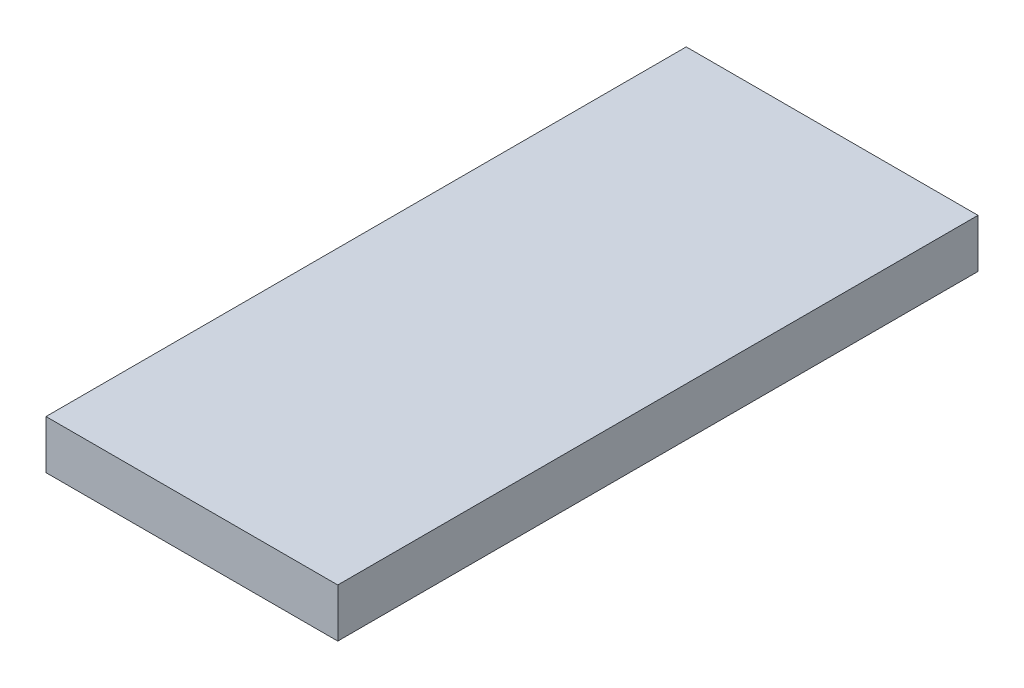
ISO-10303-21;
HEADER;
FILE_DESCRIPTION(('STEP AP214'),'2;1');
FILE_NAME('part.step','',(''),(''),'','','');
FILE_SCHEMA(('AUTOMOTIVE_DESIGN { 1 0 10303 214 1 1 1 1 }'));
ENDSEC;
DATA;
#1=APPLICATION_CONTEXT('core data for automotive mechanical design processes');
#2=APPLICATION_PROTOCOL_DEFINITION('international standard','automotive_design',2000,#1);
#3=PRODUCT_CONTEXT('',#1,'mechanical');
#4=PRODUCT('Part','Part','',(#3));
#5=PRODUCT_RELATED_PRODUCT_CATEGORY('part','',(#4));
#6=PRODUCT_DEFINITION_FORMATION('','',#4);
#7=PRODUCT_DEFINITION_CONTEXT('part definition',#1,'design');
#8=PRODUCT_DEFINITION('design','',#6,#7);
#9=PRODUCT_DEFINITION_SHAPE('','',#8);
#10=(LENGTH_UNIT() NAMED_UNIT(*) SI_UNIT(.MILLI.,.METRE.));
#11=(NAMED_UNIT(*) PLANE_ANGLE_UNIT() SI_UNIT($,.RADIAN.));
#12=(NAMED_UNIT(*) SI_UNIT($,.STERADIAN.) SOLID_ANGLE_UNIT());
#13=UNCERTAINTY_MEASURE_WITH_UNIT(LENGTH_MEASURE(1.E-05),#10,'distance_accuracy_value','');
#14=(GEOMETRIC_REPRESENTATION_CONTEXT(3) GLOBAL_UNCERTAINTY_ASSIGNED_CONTEXT((#13)) GLOBAL_UNIT_ASSIGNED_CONTEXT((#10,
#11,#12)) REPRESENTATION_CONTEXT('',''));
#15=CARTESIAN_POINT('',(0.,0.,0.));
#16=DIRECTION('',(0.,0.,1.));
#17=DIRECTION('',(1.,0.,0.));
#18=AXIS2_PLACEMENT_3D('',#15,#16,#17);
#19=CARTESIAN_POINT('',(18.,3.,0.));
#20=DIRECTION('',(0.,0.,-1.));
#21=DIRECTION('',(-1.,0.,0.));
#22=AXIS2_PLACEMENT_3D('',#19,#20,#21);
#23=PLANE('',#22);
#24=DIRECTION('',(1.,0.,0.));
#25=VECTOR('',#24,1.);
#26=CARTESIAN_POINT('',(18.,0.,0.));
#27=LINE('',#26,#25);
#28=CARTESIAN_POINT('',(0.,0.,0.));
#29=VERTEX_POINT('',#28);
#30=CARTESIAN_POINT('',(18.,0.,0.));
#31=VERTEX_POINT('',#30);
#32=EDGE_CURVE('E95',#29,#31,#27,.T.);
#33=ORIENTED_EDGE('',*,*,#32,.T.);
#34=DIRECTION('',(0.,-1.,0.));
#35=VECTOR('',#34,1.);
#36=CARTESIAN_POINT('',(18.,3.,0.));
#37=LINE('',#36,#35);
#38=CARTESIAN_POINT('',(18.,3.,0.));
#39=VERTEX_POINT('',#38);
#40=EDGE_CURVE('E11',#39,#31,#37,.T.);
#41=ORIENTED_EDGE('',*,*,#40,.F.);
#42=DIRECTION('',(1.,0.,0.));
#43=VECTOR('',#42,1.);
#44=CARTESIAN_POINT('',(18.,3.,0.));
#45=LINE('',#44,#43);
#46=CARTESIAN_POINT('',(0.,3.,0.));
#47=VERTEX_POINT('',#46);
#48=EDGE_CURVE('E83',#47,#39,#45,.T.);
#49=ORIENTED_EDGE('',*,*,#48,.F.);
#50=DIRECTION('',(0.,-1.,0.));
#51=VECTOR('',#50,1.);
#52=CARTESIAN_POINT('',(0.,3.,0.));
#53=LINE('',#52,#51);
#54=EDGE_CURVE('E91',#47,#29,#53,.T.);
#55=ORIENTED_EDGE('',*,*,#54,.T.);
#56=EDGE_LOOP('',(#33,#41,#49,#55));
#57=FACE_BOUND('',#56,.T.);
#58=ADVANCED_FACE('F32',(#57),#23,.F.);
#59=CARTESIAN_POINT('',(18.,3.,-39.5));
#60=DIRECTION('',(-1.,0.,0.));
#61=DIRECTION('',(0.,0.,1.));
#62=AXIS2_PLACEMENT_3D('',#59,#60,#61);
#63=PLANE('',#62);
#64=DIRECTION('',(0.,0.,-1.));
#65=VECTOR('',#64,1.);
#66=CARTESIAN_POINT('',(18.,0.,-39.5));
#67=LINE('',#66,#65);
#68=CARTESIAN_POINT('',(18.,0.,-39.5));
#69=VERTEX_POINT('',#68);
#70=EDGE_CURVE('E87',#31,#69,#67,.T.);
#71=ORIENTED_EDGE('',*,*,#70,.T.);
#72=DIRECTION('',(0.,-1.,0.));
#73=VECTOR('',#72,1.);
#74=CARTESIAN_POINT('',(18.,3.,-39.5));
#75=LINE('',#74,#73);
#76=CARTESIAN_POINT('',(18.,3.,-39.5));
#77=VERTEX_POINT('',#76);
#78=EDGE_CURVE('E40',#77,#69,#75,.T.);
#79=ORIENTED_EDGE('',*,*,#78,.F.);
#80=DIRECTION('',(0.,0.,-1.));
#81=VECTOR('',#80,1.);
#82=CARTESIAN_POINT('',(18.,3.,-39.5));
#83=LINE('',#82,#81);
#84=EDGE_CURVE('E78',#39,#77,#83,.T.);
#85=ORIENTED_EDGE('',*,*,#84,.F.);
#86=ORIENTED_EDGE('',*,*,#40,.T.);
#87=EDGE_LOOP('',(#71,#79,#85,#86));
#88=FACE_BOUND('',#87,.T.);
#89=ADVANCED_FACE('F86',(#88),#63,.F.);
#90=CARTESIAN_POINT('',(0.,3.,-39.5));
#91=DIRECTION('',(0.,0.,1.));
#92=DIRECTION('',(1.,0.,0.));
#93=AXIS2_PLACEMENT_3D('',#90,#91,#92);
#94=PLANE('',#93);
#95=DIRECTION('',(-1.,0.,0.));
#96=VECTOR('',#95,1.);
#97=CARTESIAN_POINT('',(0.,0.,-39.5));
#98=LINE('',#97,#96);
#99=CARTESIAN_POINT('',(0.,0.,-39.5));
#100=VERTEX_POINT('',#99);
#101=EDGE_CURVE('E65',#69,#100,#98,.T.);
#102=ORIENTED_EDGE('',*,*,#101,.T.);
#103=DIRECTION('',(0.,-1.,0.));
#104=VECTOR('',#103,1.);
#105=CARTESIAN_POINT('',(0.,3.,-39.5));
#106=LINE('',#105,#104);
#107=CARTESIAN_POINT('',(0.,3.,-39.5));
#108=VERTEX_POINT('',#107);
#109=EDGE_CURVE('E88',#108,#100,#106,.T.);
#110=ORIENTED_EDGE('',*,*,#109,.F.);
#111=DIRECTION('',(-1.,0.,0.));
#112=VECTOR('',#111,1.);
#113=CARTESIAN_POINT('',(0.,3.,-39.5));
#114=LINE('',#113,#112);
#115=EDGE_CURVE('E81',#77,#108,#114,.T.);
#116=ORIENTED_EDGE('',*,*,#115,.F.);
#117=ORIENTED_EDGE('',*,*,#78,.T.);
#118=EDGE_LOOP('',(#102,#110,#116,#117));
#119=FACE_BOUND('',#118,.T.);
#120=ADVANCED_FACE('F89',(#119),#94,.F.);
#121=CARTESIAN_POINT('',(0.,3.,0.));
#122=DIRECTION('',(1.,0.,0.));
#123=DIRECTION('',(0.,0.,-1.));
#124=AXIS2_PLACEMENT_3D('',#121,#122,#123);
#125=PLANE('',#124);
#126=DIRECTION('',(0.,0.,1.));
#127=VECTOR('',#126,1.);
#128=CARTESIAN_POINT('',(0.,0.,0.));
#129=LINE('',#128,#127);
#130=EDGE_CURVE('E71',#100,#29,#129,.T.);
#131=ORIENTED_EDGE('',*,*,#130,.T.);
#132=ORIENTED_EDGE('',*,*,#54,.F.);
#133=DIRECTION('',(0.,0.,1.));
#134=VECTOR('',#133,1.);
#135=CARTESIAN_POINT('',(0.,3.,0.));
#136=LINE('',#135,#134);
#137=EDGE_CURVE('E48',#108,#47,#136,.T.);
#138=ORIENTED_EDGE('',*,*,#137,.F.);
#139=ORIENTED_EDGE('',*,*,#109,.T.);
#140=EDGE_LOOP('',(#131,#132,#138,#139));
#141=FACE_BOUND('',#140,.T.);
#142=ADVANCED_FACE('F102',(#141),#125,.F.);
#143=CARTESIAN_POINT('',(0.,3.,0.));
#144=DIRECTION('',(0.,-1.,0.));
#145=DIRECTION('',(0.,0.,-1.));
#146=AXIS2_PLACEMENT_3D('',#143,#144,#145);
#147=PLANE('',#146);
#148=ORIENTED_EDGE('',*,*,#48,.T.);
#149=ORIENTED_EDGE('',*,*,#84,.T.);
#150=ORIENTED_EDGE('',*,*,#115,.T.);
#151=ORIENTED_EDGE('',*,*,#137,.T.);
#152=EDGE_LOOP('',(#148,#149,#150,#151));
#153=FACE_BOUND('',#152,.T.);
#154=ADVANCED_FACE('F79',(#153),#147,.F.);
#155=CARTESIAN_POINT('',(0.,0.,0.));
#156=DIRECTION('',(0.,-1.,0.));
#157=DIRECTION('',(0.,0.,-1.));
#158=AXIS2_PLACEMENT_3D('',#155,#156,#157);
#159=PLANE('',#158);
#160=ORIENTED_EDGE('',*,*,#32,.F.);
#161=ORIENTED_EDGE('',*,*,#130,.F.);
#162=ORIENTED_EDGE('',*,*,#101,.F.);
#163=ORIENTED_EDGE('',*,*,#70,.F.);
#164=EDGE_LOOP('',(#160,#161,#162,#163));
#165=FACE_BOUND('',#164,.T.);
#166=ADVANCED_FACE('F105',(#165),#159,.T.);
#167=CLOSED_SHELL('',(#58,#89,#120,#142,#154,#166));
#168=MANIFOLD_SOLID_BREP('B2',#167);
#169=ADVANCED_BREP_SHAPE_REPRESENTATION('',(#18,#168),#14);
#170=SHAPE_DEFINITION_REPRESENTATION(#9,#169);
ENDSEC;
END-ISO-10303-21;
